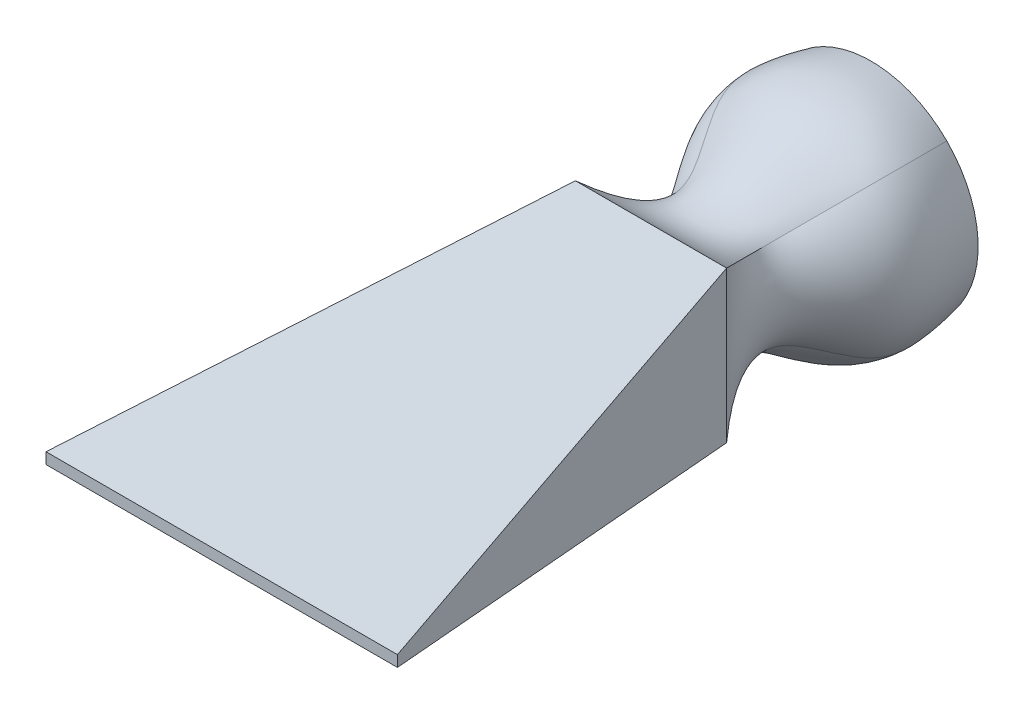
ISO-10303-21;
HEADER;
FILE_DESCRIPTION(('STEP AP214'),'2;1');
FILE_NAME('part.step','',(''),(''),'','','');
FILE_SCHEMA(('AUTOMOTIVE_DESIGN { 1 0 10303 214 1 1 1 1 }'));
ENDSEC;
DATA;
#1=APPLICATION_CONTEXT('core data for automotive mechanical design processes');
#2=APPLICATION_PROTOCOL_DEFINITION('international standard','automotive_design',2000,#1);
#3=PRODUCT_CONTEXT('',#1,'mechanical');
#4=PRODUCT('Part','Part','',(#3));
#5=PRODUCT_RELATED_PRODUCT_CATEGORY('part','',(#4));
#6=PRODUCT_DEFINITION_FORMATION('','',#4);
#7=PRODUCT_DEFINITION_CONTEXT('part definition',#1,'design');
#8=PRODUCT_DEFINITION('design','',#6,#7);
#9=PRODUCT_DEFINITION_SHAPE('','',#8);
#10=(LENGTH_UNIT() NAMED_UNIT(*) SI_UNIT(.MILLI.,.METRE.));
#11=(NAMED_UNIT(*) PLANE_ANGLE_UNIT() SI_UNIT($,.RADIAN.));
#12=(NAMED_UNIT(*) SI_UNIT($,.STERADIAN.) SOLID_ANGLE_UNIT());
#13=UNCERTAINTY_MEASURE_WITH_UNIT(LENGTH_MEASURE(1.E-05),#10,'distance_accuracy_value','');
#14=(GEOMETRIC_REPRESENTATION_CONTEXT(3) GLOBAL_UNCERTAINTY_ASSIGNED_CONTEXT((#13)) GLOBAL_UNIT_ASSIGNED_CONTEXT((#10,
#11,#12)) REPRESENTATION_CONTEXT('',''));
#15=CARTESIAN_POINT('',(0.,0.,0.));
#16=DIRECTION('',(0.,0.,1.));
#17=DIRECTION('',(1.,0.,0.));
#18=AXIS2_PLACEMENT_3D('',#15,#16,#17);
#19=CARTESIAN_POINT('',(0.,0.,0.));
#20=DIRECTION('',(0.,0.,1.));
#21=DIRECTION('',(1.,0.,0.));
#22=AXIS2_PLACEMENT_3D('',#19,#20,#21);
#23=PLANE('',#22);
#24=CARTESIAN_POINT('',(0.,0.,0.));
#25=DIRECTION('',(0.,0.,1.));
#26=DIRECTION('',(1.,0.,0.));
#27=AXIS2_PLACEMENT_3D('',#24,#25,#26);
#28=CIRCLE('',#27,48.0832611206853);
#29=CARTESIAN_POINT('',(-34.,34.,0.));
#30=VERTEX_POINT('',#29);
#31=CARTESIAN_POINT('',(-34.,-34.,0.));
#32=VERTEX_POINT('',#31);
#33=EDGE_CURVE('E12',#30,#32,#28,.T.);
#34=ORIENTED_EDGE('',*,*,#33,.F.);
#35=CARTESIAN_POINT('',(34.,34.,0.));
#36=VERTEX_POINT('',#35);
#37=EDGE_CURVE('E338',#36,#30,#28,.T.);
#38=ORIENTED_EDGE('',*,*,#37,.F.);
#39=CARTESIAN_POINT('',(34.,-34.,0.));
#40=VERTEX_POINT('',#39);
#41=EDGE_CURVE('E339',#40,#36,#28,.T.);
#42=ORIENTED_EDGE('',*,*,#41,.F.);
#43=EDGE_CURVE('E82',#32,#40,#28,.T.);
#44=ORIENTED_EDGE('',*,*,#43,.F.);
#45=EDGE_LOOP('',(#34,#38,#42,#44));
#46=FACE_BOUND('',#45,.T.);
#47=ADVANCED_FACE('F72',(#46),#23,.F.);
#48=CARTESIAN_POINT('',(34.,34.,99.));
#49=CARTESIAN_POINT('',(25.0040644362733,25.0040644362733,88.));
#50=CARTESIAN_POINT('',(13.4214700705891,13.4214700705891,64.3051609146192));
#51=CARTESIAN_POINT('',(38.1308054514588,38.1308054514588,35.7945659439873));
#52=CARTESIAN_POINT('',(36.0754701746698,36.0754701746698,11.8486725434439));
#53=CARTESIAN_POINT('',(34.,34.,0.));
#54=CARTESIAN_POINT('',(34.,11.3333333333333,99.));
#55=CARTESIAN_POINT('',(25.0040644362733,8.33468814542442,88.));
#56=CARTESIAN_POINT('',(27.5730687796223,7.41615934743147,64.3051609146192));
#57=CARTESIAN_POINT('',(58.0567627558353,16.8531828307176,35.7945659439873));
#58=CARTESIAN_POINT('',(54.8405805120552,15.9267130541712,11.8486725434439));
#59=CARTESIAN_POINT('',(52.7651103373854,15.2348896626146,0.));
#60=CARTESIAN_POINT('',(34.,-11.3333333333333,99.));
#61=CARTESIAN_POINT('',(25.0040644362733,-8.33468814542442,88.));
#62=CARTESIAN_POINT('',(27.5730687796223,-7.4161593474315,64.3051609146192));
#63=CARTESIAN_POINT('',(58.0567627558353,-16.8531828307176,35.7945659439873));
#64=CARTESIAN_POINT('',(54.8405805120552,-15.9267130541712,11.8486725434439));
#65=CARTESIAN_POINT('',(52.7651103373854,-15.2348896626146,0.));
#66=CARTESIAN_POINT('',(34.,-34.,99.));
#67=CARTESIAN_POINT('',(25.0040644362733,-25.0040644362733,88.));
#68=CARTESIAN_POINT('',(13.4214700705891,-13.4214700705891,64.3051609146192));
#69=CARTESIAN_POINT('',(38.1308054514588,-38.1308054514588,35.7945659439873));
#70=CARTESIAN_POINT('',(36.0754701746698,-36.0754701746698,11.8486725434439));
#71=CARTESIAN_POINT('',(34.,-34.,0.));
#72=B_SPLINE_SURFACE_WITH_KNOTS('',3,3,((#48,#49,#50,#51,#52,#53),(#54,#55,#56,#57,#58,#59),
(#60,#61,#62,#63,#64,#65),(#66,#67,#68,#69,#70,#71)),.UNSPECIFIED.,.F.,.F.,.F.,(4,4),(4,1,1,4),
(0.,1.),(0.,0.334508099972556,0.691210840117049,1.),.UNSPECIFIED.);
#73=DIRECTION('',(0.,1.,0.));
#74=VECTOR('',#73,1.);
#75=CARTESIAN_POINT('',(34.,34.,99.));
#76=LINE('',#75,#74);
#77=CARTESIAN_POINT('',(34.,-34.,99.));
#78=VERTEX_POINT('',#77);
#79=CARTESIAN_POINT('',(34.,34.,99.));
#80=VERTEX_POINT('',#79);
#81=EDGE_CURVE('E76',#78,#80,#76,.T.);
#82=CARTESIAN_POINT('',(34.,-34.,99.));
#83=CARTESIAN_POINT('',(25.0040644362733,-25.0040644362733,88.));
#84=CARTESIAN_POINT('',(13.4214700705891,-13.4214700705891,64.3051609146192));
#85=CARTESIAN_POINT('',(38.1308054514588,-38.1308054514588,35.7945659439873));
#86=CARTESIAN_POINT('',(36.0754701746698,-36.0754701746698,11.8486725434439));
#87=CARTESIAN_POINT('',(34.,-34.,0.));
#88=B_SPLINE_CURVE_WITH_KNOTS('',3,(#82,#83,#84,#85,#86,#87),.UNSPECIFIED.,.F.,.F.,(4,1,1,4),
(0.,0.334508099972556,0.691210840117049,1.),.UNSPECIFIED.);
#89=EDGE_CURVE('E311',#78,#40,#88,.T.);
#90=CARTESIAN_POINT('',(34.,34.,99.));
#91=CARTESIAN_POINT('',(25.0040644362733,25.0040644362733,88.));
#92=CARTESIAN_POINT('',(13.4214700705891,13.4214700705891,64.3051609146192));
#93=CARTESIAN_POINT('',(38.1308054514588,38.1308054514588,35.7945659439873));
#94=CARTESIAN_POINT('',(36.0754701746698,36.0754701746698,11.8486725434439));
#95=CARTESIAN_POINT('',(34.,34.,0.));
#96=B_SPLINE_CURVE_WITH_KNOTS('',3,(#90,#91,#92,#93,#94,#95),.UNSPECIFIED.,.F.,.F.,(4,1,1,4),
(0.,0.334508099972556,0.691210840117049,1.),.UNSPECIFIED.);
#97=EDGE_CURVE('E310',#36,#80,#96,.F.);
#98=ORIENTED_EDGE('',*,*,#81,.F.);
#99=ORIENTED_EDGE('',*,*,#89,.T.);
#100=ORIENTED_EDGE('',*,*,#41,.T.);
#101=ORIENTED_EDGE('',*,*,#97,.T.);
#102=EDGE_LOOP('',(#98,#99,#100,#101));
#103=FACE_BOUND('',#102,.T.);
#104=ADVANCED_FACE('F186',(#103),#72,.T.);
#105=CARTESIAN_POINT('',(34.,-34.,99.));
#106=CARTESIAN_POINT('',(25.0040644362733,-25.0040644362733,88.));
#107=CARTESIAN_POINT('',(13.4214700705891,-13.4214700705891,64.3051609146192));
#108=CARTESIAN_POINT('',(38.1308054514588,-38.1308054514588,35.7945659439873));
#109=CARTESIAN_POINT('',(36.0754701746698,-36.0754701746698,11.8486725434439));
#110=CARTESIAN_POINT('',(34.,-34.,0.));
#111=CARTESIAN_POINT('',(11.3333333333333,-34.,99.));
#112=CARTESIAN_POINT('',(8.33468814542442,-25.0040644362733,88.));
#113=CARTESIAN_POINT('',(7.41615934743147,-27.5730687796223,64.3051609146192));
#114=CARTESIAN_POINT('',(16.8531828307176,-58.0567627558353,35.7945659439873));
#115=CARTESIAN_POINT('',(15.9267130541712,-54.8405805120552,11.8486725434439));
#116=CARTESIAN_POINT('',(15.2348896626146,-52.7651103373854,0.));
#117=CARTESIAN_POINT('',(-11.3333333333333,-34.,99.));
#118=CARTESIAN_POINT('',(-8.33468814542442,-25.0040644362733,88.));
#119=CARTESIAN_POINT('',(-7.4161593474315,-27.5730687796223,64.3051609146192));
#120=CARTESIAN_POINT('',(-16.8531828307176,-58.0567627558353,35.7945659439873));
#121=CARTESIAN_POINT('',(-15.9267130541712,-54.8405805120552,11.8486725434439));
#122=CARTESIAN_POINT('',(-15.2348896626146,-52.7651103373854,0.));
#123=CARTESIAN_POINT('',(-34.,-34.,99.));
#124=CARTESIAN_POINT('',(-25.0040644362733,-25.0040644362733,88.));
#125=CARTESIAN_POINT('',(-13.4214700705891,-13.4214700705891,64.3051609146192));
#126=CARTESIAN_POINT('',(-38.1308054514588,-38.1308054514588,35.7945659439873));
#127=CARTESIAN_POINT('',(-36.0754701746698,-36.0754701746698,11.8486725434439));
#128=CARTESIAN_POINT('',(-34.,-34.,0.));
#129=B_SPLINE_SURFACE_WITH_KNOTS('',3,3,((#105,#106,#107,#108,#109,#110),(#111,#112,#113,#114,
#115,#116),(#117,#118,#119,#120,#121,#122),(#123,#124,#125,#126,#127,#128)),.UNSPECIFIED.,.F.,
.F.,.F.,(4,4),(4,1,1,4),(0.,1.),(0.,0.334508099972556,0.691210840117049,1.),.UNSPECIFIED.);
#130=DIRECTION('',(1.,0.,0.));
#131=VECTOR('',#130,1.);
#132=CARTESIAN_POINT('',(-34.,-34.,99.));
#133=LINE('',#132,#131);
#134=CARTESIAN_POINT('',(-34.,-34.,99.));
#135=VERTEX_POINT('',#134);
#136=EDGE_CURVE('E313',#135,#78,#133,.T.);
#137=CARTESIAN_POINT('',(-34.,-34.,99.));
#138=CARTESIAN_POINT('',(-25.0040644362733,-25.0040644362733,88.));
#139=CARTESIAN_POINT('',(-13.4214700705891,-13.4214700705891,64.3051609146192));
#140=CARTESIAN_POINT('',(-38.1308054514588,-38.1308054514588,35.7945659439873));
#141=CARTESIAN_POINT('',(-36.0754701746698,-36.0754701746698,11.8486725434439));
#142=CARTESIAN_POINT('',(-34.,-34.,0.));
#143=B_SPLINE_CURVE_WITH_KNOTS('',3,(#137,#138,#139,#140,#141,#142),.UNSPECIFIED.,.F.,.F.,(4,1,
1,4),(0.,0.334508099972556,0.691210840117049,1.),.UNSPECIFIED.);
#144=EDGE_CURVE('E90',#135,#32,#143,.T.);
#145=ORIENTED_EDGE('',*,*,#136,.F.);
#146=ORIENTED_EDGE('',*,*,#144,.T.);
#147=ORIENTED_EDGE('',*,*,#43,.T.);
#148=ORIENTED_EDGE('',*,*,#89,.F.);
#149=EDGE_LOOP('',(#145,#146,#147,#148));
#150=FACE_BOUND('',#149,.T.);
#151=ADVANCED_FACE('F414',(#150),#129,.T.);
#152=CARTESIAN_POINT('',(-34.,34.,99.));
#153=CARTESIAN_POINT('',(-25.0040644362733,25.0040644362733,88.));
#154=CARTESIAN_POINT('',(-13.4214700705891,13.4214700705891,64.3051609146192));
#155=CARTESIAN_POINT('',(-38.1308054514588,38.1308054514588,35.7945659439873));
#156=CARTESIAN_POINT('',(-36.0754701746698,36.0754701746698,11.8486725434439));
#157=CARTESIAN_POINT('',(-34.,34.,0.));
#158=CARTESIAN_POINT('',(-11.3333333333333,34.,99.));
#159=CARTESIAN_POINT('',(-8.33468814542442,25.0040644362733,88.));
#160=CARTESIAN_POINT('',(-7.41615934743148,27.5730687796223,64.3051609146192));
#161=CARTESIAN_POINT('',(-16.8531828307176,58.0567627558353,35.7945659439873));
#162=CARTESIAN_POINT('',(-15.9267130541712,54.8405805120552,11.8486725434439));
#163=CARTESIAN_POINT('',(-15.2348896626146,52.7651103373854,0.));
#164=CARTESIAN_POINT('',(11.3333333333333,34.,99.));
#165=CARTESIAN_POINT('',(8.33468814542442,25.0040644362733,88.));
#166=CARTESIAN_POINT('',(7.41615934743149,27.5730687796223,64.3051609146192));
#167=CARTESIAN_POINT('',(16.8531828307176,58.0567627558353,35.7945659439873));
#168=CARTESIAN_POINT('',(15.9267130541712,54.8405805120552,11.8486725434439));
#169=CARTESIAN_POINT('',(15.2348896626146,52.7651103373854,0.));
#170=CARTESIAN_POINT('',(34.,34.,99.));
#171=CARTESIAN_POINT('',(25.0040644362733,25.0040644362733,88.));
#172=CARTESIAN_POINT('',(13.4214700705891,13.4214700705891,64.3051609146192));
#173=CARTESIAN_POINT('',(38.1308054514588,38.1308054514588,35.7945659439873));
#174=CARTESIAN_POINT('',(36.0754701746698,36.0754701746698,11.8486725434439));
#175=CARTESIAN_POINT('',(34.,34.,0.));
#176=B_SPLINE_SURFACE_WITH_KNOTS('',3,3,((#152,#153,#154,#155,#156,#157),(#158,#159,#160,#161,
#162,#163),(#164,#165,#166,#167,#168,#169),(#170,#171,#172,#173,#174,#175)),.UNSPECIFIED.,.F.,
.F.,.F.,(4,4),(4,1,1,4),(0.,1.),(0.,0.334508099972556,0.691210840117049,1.),.UNSPECIFIED.);
#177=DIRECTION('',(-1.,0.,0.));
#178=VECTOR('',#177,1.);
#179=CARTESIAN_POINT('',(-34.,34.,99.));
#180=LINE('',#179,#178);
#181=CARTESIAN_POINT('',(-34.,34.,99.));
#182=VERTEX_POINT('',#181);
#183=EDGE_CURVE('E306',#80,#182,#180,.T.);
#184=CARTESIAN_POINT('',(-34.,34.,99.));
#185=CARTESIAN_POINT('',(-25.0040644362733,25.0040644362733,88.));
#186=CARTESIAN_POINT('',(-13.4214700705891,13.4214700705891,64.3051609146192));
#187=CARTESIAN_POINT('',(-38.1308054514588,38.1308054514588,35.7945659439873));
#188=CARTESIAN_POINT('',(-36.0754701746698,36.0754701746698,11.8486725434439));
#189=CARTESIAN_POINT('',(-34.,34.,0.));
#190=B_SPLINE_CURVE_WITH_KNOTS('',3,(#184,#185,#186,#187,#188,#189),.UNSPECIFIED.,.F.,.F.,(4,1,
1,4),(0.,0.334508099972556,0.691210840117049,1.),.UNSPECIFIED.);
#191=EDGE_CURVE('E360',#182,#30,#190,.T.);
#192=ORIENTED_EDGE('',*,*,#183,.F.);
#193=ORIENTED_EDGE('',*,*,#97,.F.);
#194=ORIENTED_EDGE('',*,*,#37,.T.);
#195=ORIENTED_EDGE('',*,*,#191,.F.);
#196=EDGE_LOOP('',(#192,#193,#194,#195));
#197=FACE_BOUND('',#196,.T.);
#198=ADVANCED_FACE('F424',(#197),#176,.T.);
#199=CARTESIAN_POINT('',(-34.,-34.,99.));
#200=CARTESIAN_POINT('',(-25.0040644362733,-25.0040644362733,88.));
#201=CARTESIAN_POINT('',(-13.4214700705891,-13.4214700705891,64.3051609146192));
#202=CARTESIAN_POINT('',(-38.1308054514588,-38.1308054514588,35.7945659439873));
#203=CARTESIAN_POINT('',(-36.0754701746698,-36.0754701746698,11.8486725434439));
#204=CARTESIAN_POINT('',(-34.,-34.,0.));
#205=CARTESIAN_POINT('',(-34.,-11.3333333333333,99.));
#206=CARTESIAN_POINT('',(-25.0040644362733,-8.33468814542442,88.));
#207=CARTESIAN_POINT('',(-27.5730687796223,-7.41615934743148,64.3051609146192));
#208=CARTESIAN_POINT('',(-58.0567627558353,-16.8531828307176,35.7945659439873));
#209=CARTESIAN_POINT('',(-54.8405805120552,-15.9267130541712,11.8486725434439));
#210=CARTESIAN_POINT('',(-52.7651103373854,-15.2348896626146,0.));
#211=CARTESIAN_POINT('',(-34.,11.3333333333333,99.));
#212=CARTESIAN_POINT('',(-25.0040644362733,8.33468814542442,88.));
#213=CARTESIAN_POINT('',(-27.5730687796223,7.41615934743149,64.3051609146192));
#214=CARTESIAN_POINT('',(-58.0567627558353,16.8531828307176,35.7945659439873));
#215=CARTESIAN_POINT('',(-54.8405805120552,15.9267130541712,11.8486725434439));
#216=CARTESIAN_POINT('',(-52.7651103373854,15.2348896626146,0.));
#217=CARTESIAN_POINT('',(-34.,34.,99.));
#218=CARTESIAN_POINT('',(-25.0040644362733,25.0040644362733,88.));
#219=CARTESIAN_POINT('',(-13.4214700705891,13.4214700705891,64.3051609146192));
#220=CARTESIAN_POINT('',(-38.1308054514588,38.1308054514588,35.7945659439873));
#221=CARTESIAN_POINT('',(-36.0754701746698,36.0754701746698,11.8486725434439));
#222=CARTESIAN_POINT('',(-34.,34.,0.));
#223=B_SPLINE_SURFACE_WITH_KNOTS('',3,3,((#199,#200,#201,#202,#203,#204),(#205,#206,#207,#208,
#209,#210),(#211,#212,#213,#214,#215,#216),(#217,#218,#219,#220,#221,#222)),.UNSPECIFIED.,.F.,
.F.,.F.,(4,4),(4,1,1,4),(0.,1.),(0.,0.334508099972556,0.691210840117049,1.),.UNSPECIFIED.);
#224=DIRECTION('',(0.,-1.,0.));
#225=VECTOR('',#224,1.);
#226=CARTESIAN_POINT('',(-34.,34.,99.));
#227=LINE('',#226,#225);
#228=EDGE_CURVE('E153',#182,#135,#227,.T.);
#229=ORIENTED_EDGE('',*,*,#228,.F.);
#230=ORIENTED_EDGE('',*,*,#191,.T.);
#231=ORIENTED_EDGE('',*,*,#33,.T.);
#232=ORIENTED_EDGE('',*,*,#144,.F.);
#233=EDGE_LOOP('',(#229,#230,#231,#232));
#234=FACE_BOUND('',#233,.T.);
#235=ADVANCED_FACE('F182',(#234),#223,.T.);
#236=CARTESIAN_POINT('',(0.,0.,292.));
#237=DIRECTION('',(0.,0.,-1.));
#238=DIRECTION('',(-1.,0.,0.));
#239=AXIS2_PLACEMENT_3D('',#236,#237,#238);
#240=PLANE('',#239);
#241=DIRECTION('',(0.,-1.,0.));
#242=VECTOR('',#241,1.);
#243=CARTESIAN_POINT('',(-79.,2.49999999999999,292.));
#244=LINE('',#243,#242);
#245=CARTESIAN_POINT('',(-79.,2.49999999999999,292.));
#246=VERTEX_POINT('',#245);
#247=CARTESIAN_POINT('',(-79.,-2.50000000000001,292.));
#248=VERTEX_POINT('',#247);
#249=EDGE_CURVE('E142',#246,#248,#244,.T.);
#250=ORIENTED_EDGE('',*,*,#249,.T.);
#251=DIRECTION('',(1.,0.,0.));
#252=VECTOR('',#251,1.);
#253=CARTESIAN_POINT('',(79.,-2.49999999999999,292.));
#254=LINE('',#253,#252);
#255=CARTESIAN_POINT('',(79.,-2.49999999999999,292.));
#256=VERTEX_POINT('',#255);
#257=EDGE_CURVE('E129',#248,#256,#254,.T.);
#258=ORIENTED_EDGE('',*,*,#257,.T.);
#259=DIRECTION('',(0.,1.,0.));
#260=VECTOR('',#259,1.);
#261=CARTESIAN_POINT('',(79.,2.50000000000001,292.));
#262=LINE('',#261,#260);
#263=CARTESIAN_POINT('',(79.,2.50000000000001,292.));
#264=VERTEX_POINT('',#263);
#265=EDGE_CURVE('E141',#256,#264,#262,.T.);
#266=ORIENTED_EDGE('',*,*,#265,.T.);
#267=DIRECTION('',(-1.,0.,0.));
#268=VECTOR('',#267,1.);
#269=CARTESIAN_POINT('',(79.,2.50000000000001,292.));
#270=LINE('',#269,#268);
#271=EDGE_CURVE('E160',#264,#246,#270,.T.);
#272=ORIENTED_EDGE('',*,*,#271,.T.);
#273=EDGE_LOOP('',(#250,#258,#266,#272));
#274=FACE_BOUND('',#273,.T.);
#275=ADVANCED_FACE('F158',(#274),#240,.F.);
#276=CARTESIAN_POINT('',(-10.354203798951,0.,-2.41419259561033));
#277=DIRECTION('',(0.973878416925231,0.,0.227070097210546));
#278=DIRECTION('',(0.227070097210546,0.,-0.973878416925231));
#279=AXIS2_PLACEMENT_3D('',#276,#277,#278);
#280=PLANE('',#279);
#281=DIRECTION('',(-0.224254889549626,0.156978422684739,0.961804304068399));
#282=VECTOR('',#281,1.);
#283=CARTESIAN_POINT('',(-34.,-34.,99.));
#284=LINE('',#283,#282);
#285=EDGE_CURVE('E134',#135,#248,#284,.T.);
#286=ORIENTED_EDGE('',*,*,#285,.T.);
#287=ORIENTED_EDGE('',*,*,#249,.F.);
#288=DIRECTION('',(-0.224254889549626,-0.156978422684739,0.961804304068399));
#289=VECTOR('',#288,1.);
#290=CARTESIAN_POINT('',(-34.,34.,99.));
#291=LINE('',#290,#289);
#292=EDGE_CURVE('E155',#182,#246,#291,.T.);
#293=ORIENTED_EDGE('',*,*,#292,.F.);
#294=ORIENTED_EDGE('',*,*,#228,.T.);
#295=EDGE_LOOP('',(#286,#287,#293,#294));
#296=FACE_BOUND('',#295,.T.);
#297=ADVANCED_FACE('F149',(#296),#280,.F.);
#298=CARTESIAN_POINT('',(0.,48.8565750335044,7.97400058836989));
#299=DIRECTION('',(0.,-0.986941177535691,-0.161081073017483));
#300=DIRECTION('',(0.,0.161081073017483,-0.986941177535691));
#301=AXIS2_PLACEMENT_3D('',#298,#299,#300);
#302=PLANE('',#301);
#303=ORIENTED_EDGE('',*,*,#292,.T.);
#304=ORIENTED_EDGE('',*,*,#271,.F.);
#305=DIRECTION('',(0.224254889549627,-0.156978422684739,0.961804304068399));
#306=VECTOR('',#305,1.);
#307=CARTESIAN_POINT('',(34.,34.,99.));
#308=LINE('',#307,#306);
#309=EDGE_CURVE('E162',#80,#264,#308,.T.);
#310=ORIENTED_EDGE('',*,*,#309,.F.);
#311=ORIENTED_EDGE('',*,*,#183,.T.);
#312=EDGE_LOOP('',(#303,#304,#310,#311));
#313=FACE_BOUND('',#312,.T.);
#314=ADVANCED_FACE('F234',(#313),#302,.F.);
#315=CARTESIAN_POINT('',(0.,-48.8565750335044,7.97400058836989));
#316=DIRECTION('',(0.,0.986941177535691,-0.161081073017483));
#317=DIRECTION('',(0.,0.161081073017483,0.986941177535691));
#318=AXIS2_PLACEMENT_3D('',#315,#316,#317);
#319=PLANE('',#318);
#320=DIRECTION('',(0.224254889549627,0.156978422684739,0.961804304068399));
#321=VECTOR('',#320,1.);
#322=CARTESIAN_POINT('',(34.,-34.,99.));
#323=LINE('',#322,#321);
#324=EDGE_CURVE('E136',#78,#256,#323,.T.);
#325=ORIENTED_EDGE('',*,*,#324,.T.);
#326=ORIENTED_EDGE('',*,*,#257,.F.);
#327=ORIENTED_EDGE('',*,*,#285,.F.);
#328=ORIENTED_EDGE('',*,*,#136,.T.);
#329=EDGE_LOOP('',(#325,#326,#327,#328));
#330=FACE_BOUND('',#329,.T.);
#331=ADVANCED_FACE('F132',(#330),#319,.F.);
#332=CARTESIAN_POINT('',(10.354203798951,0.,-2.41419259561033));
#333=DIRECTION('',(-0.973878416925231,0.,0.227070097210546));
#334=DIRECTION('',(0.227070097210546,0.,0.973878416925231));
#335=AXIS2_PLACEMENT_3D('',#332,#333,#334);
#336=PLANE('',#335);
#337=ORIENTED_EDGE('',*,*,#309,.T.);
#338=ORIENTED_EDGE('',*,*,#265,.F.);
#339=ORIENTED_EDGE('',*,*,#324,.F.);
#340=ORIENTED_EDGE('',*,*,#81,.T.);
#341=EDGE_LOOP('',(#337,#338,#339,#340));
#342=FACE_BOUND('',#341,.T.);
#343=ADVANCED_FACE('F183',(#342),#336,.F.);
#344=CLOSED_SHELL('',(#47,#104,#151,#198,#235,#275,#297,#314,#331,#343));
#345=MANIFOLD_SOLID_BREP('B2',#344);
#346=ADVANCED_BREP_SHAPE_REPRESENTATION('',(#18,#345),#14);
#347=SHAPE_DEFINITION_REPRESENTATION(#9,#346);
ENDSEC;
END-ISO-10303-21;
